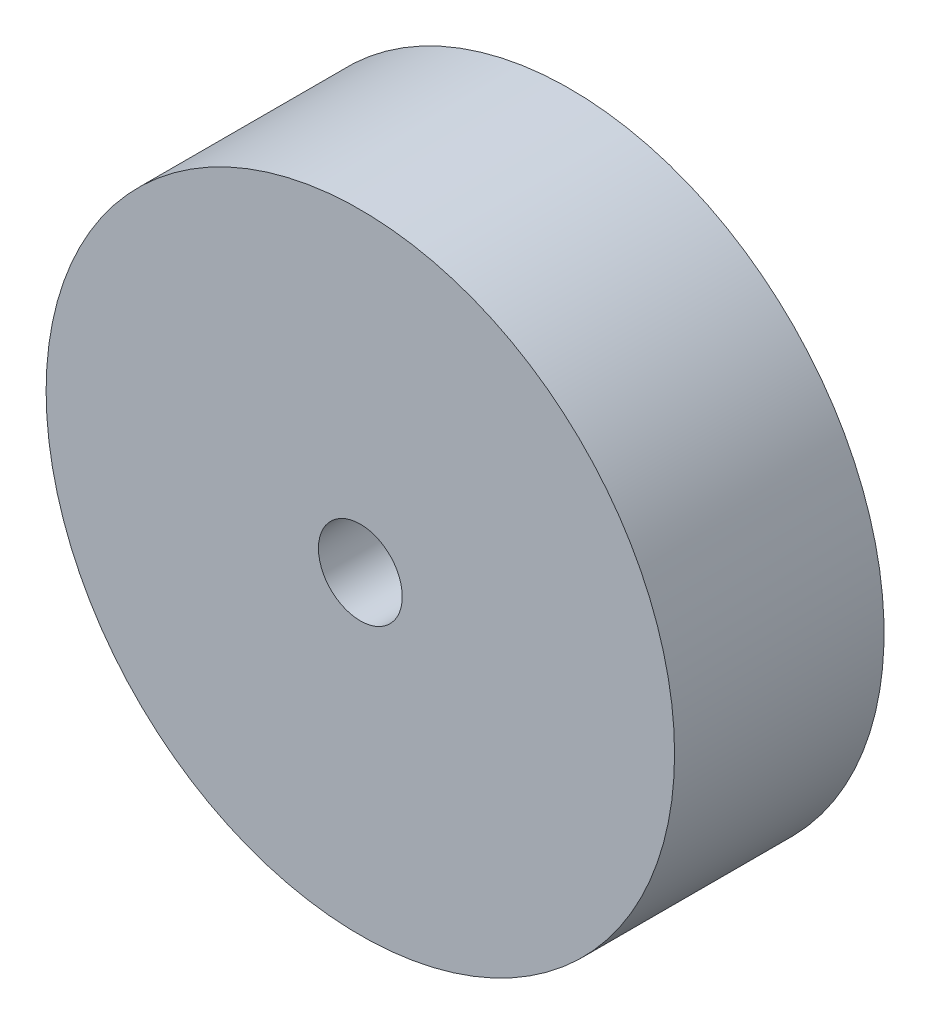
ISO-10303-21;
HEADER;
FILE_DESCRIPTION(('STEP AP214'),'2;1');
FILE_NAME('part.step','',(''),(''),'','','');
FILE_SCHEMA(('AUTOMOTIVE_DESIGN { 1 0 10303 214 1 1 1 1 }'));
ENDSEC;
DATA;
#1=APPLICATION_CONTEXT('core data for automotive mechanical design processes');
#2=APPLICATION_PROTOCOL_DEFINITION('international standard','automotive_design',2000,#1);
#3=PRODUCT_CONTEXT('',#1,'mechanical');
#4=PRODUCT('Part','Part','',(#3));
#5=PRODUCT_RELATED_PRODUCT_CATEGORY('part','',(#4));
#6=PRODUCT_DEFINITION_FORMATION('','',#4);
#7=PRODUCT_DEFINITION_CONTEXT('part definition',#1,'design');
#8=PRODUCT_DEFINITION('design','',#6,#7);
#9=PRODUCT_DEFINITION_SHAPE('','',#8);
#10=(LENGTH_UNIT() NAMED_UNIT(*) SI_UNIT(.MILLI.,.METRE.));
#11=(NAMED_UNIT(*) PLANE_ANGLE_UNIT() SI_UNIT($,.RADIAN.));
#12=(NAMED_UNIT(*) SI_UNIT($,.STERADIAN.) SOLID_ANGLE_UNIT());
#13=UNCERTAINTY_MEASURE_WITH_UNIT(LENGTH_MEASURE(1.E-05),#10,'distance_accuracy_value','');
#14=(GEOMETRIC_REPRESENTATION_CONTEXT(3) GLOBAL_UNCERTAINTY_ASSIGNED_CONTEXT((#13)) GLOBAL_UNIT_ASSIGNED_CONTEXT((#10,
#11,#12)) REPRESENTATION_CONTEXT('',''));
#15=CARTESIAN_POINT('',(0.,0.,0.));
#16=DIRECTION('',(0.,0.,1.));
#17=DIRECTION('',(1.,0.,0.));
#18=AXIS2_PLACEMENT_3D('',#15,#16,#17);
#19=CARTESIAN_POINT('',(0.,-10.,10.));
#20=DIRECTION('',(0.,0.,-1.));
#21=DIRECTION('',(-1.,0.,0.));
#22=AXIS2_PLACEMENT_3D('',#19,#20,#21);
#23=CYLINDRICAL_SURFACE('',#22,30.);
#24=CARTESIAN_POINT('',(0.,-10.,10.));
#25=DIRECTION('',(0.,0.,1.));
#26=DIRECTION('',(1.,0.,0.));
#27=AXIS2_PLACEMENT_3D('',#24,#25,#26);
#28=CIRCLE('',#27,30.);
#29=CARTESIAN_POINT('',(30.,-10.,10.));
#30=VERTEX_POINT('',#29);
#31=EDGE_CURVE('E119',#30,#30,#28,.T.);
#32=ORIENTED_EDGE('',*,*,#31,.F.);
#33=EDGE_LOOP('',(#32));
#34=FACE_BOUND('',#33,.T.);
#35=CARTESIAN_POINT('',(0.,-10.,-10.));
#36=DIRECTION('',(0.,0.,-1.));
#37=DIRECTION('',(-1.,0.,0.));
#38=AXIS2_PLACEMENT_3D('',#35,#36,#37);
#39=CIRCLE('',#38,30.);
#40=CARTESIAN_POINT('',(-30.,-10.,-10.));
#41=VERTEX_POINT('',#40);
#42=EDGE_CURVE('E85',#41,#41,#39,.T.);
#43=ORIENTED_EDGE('',*,*,#42,.F.);
#44=EDGE_LOOP('',(#43));
#45=FACE_BOUND('',#44,.T.);
#46=CARTESIAN_POINT('',(0.,-40.,-4.45));
#47=CARTESIAN_POINT('',(0.0813961460003312,-39.9999995308418,-4.44999640653951));
#48=CARTESIAN_POINT('',(0.162850100712571,-39.9996651849001,-4.44312318987351));
#49=CARTESIAN_POINT('',(0.323511229475847,-39.9983635552296,-4.4158019022667));
#50=CARTESIAN_POINT('',(0.402715637436591,-39.997395524718,-4.39533781438185));
#51=CARTESIAN_POINT('',(0.556527074857534,-39.9949360970782,-4.34142184323701));
#52=CARTESIAN_POINT('',(0.631136415445913,-39.9934449656171,-4.30797655182556));
#53=CARTESIAN_POINT('',(0.773661645076147,-39.9901073000316,-4.22905762393617));
#54=CARTESIAN_POINT('',(0.841579114472005,-39.988260850125,-4.18358683679256));
#55=CARTESIAN_POINT('',(0.968877717755085,-39.984418313588,-4.0818592699646));
#56=CARTESIAN_POINT('',(1.02825169584424,-39.982422103627,-4.02559353969628));
#57=CARTESIAN_POINT('',(1.13671696860404,-39.9785060970828,-3.90389102411298));
#58=CARTESIAN_POINT('',(1.1858078443272,-39.9765863036155,-3.83845386532284));
#59=CARTESIAN_POINT('',(1.27233271229274,-39.9730387578573,-3.7002290147037));
#60=CARTESIAN_POINT('',(1.30976118049563,-39.9714111441151,-3.62743786111723));
#61=CARTESIAN_POINT('',(1.37186331718921,-39.9686329838392,-3.47659567705896));
#62=CARTESIAN_POINT('',(1.3965370777827,-39.9674824338605,-3.39854468457348));
#63=CARTESIAN_POINT('',(1.43241066965505,-39.9657892492122,-3.23946365895841));
#64=CARTESIAN_POINT('',(1.44362111515415,-39.9652461356745,-3.15843602456853));
#65=CARTESIAN_POINT('',(1.45228259919691,-39.9648276310762,-2.99564732043953));
#66=CARTESIAN_POINT('',(1.44973374082222,-39.9649522350131,-2.91388625619968));
#67=CARTESIAN_POINT('',(1.43095781825595,-39.9658546688222,-2.75202371701596));
#68=CARTESIAN_POINT('',(1.41474222119876,-39.9666319510599,-2.67192090841777));
#69=CARTESIAN_POINT('',(1.36911089052534,-39.9687512700535,-2.5155756439929));
#70=CARTESIAN_POINT('',(1.33969510385768,-39.9700933090792,-2.43933320368237));
#71=CARTESIAN_POINT('',(1.26848529631535,-39.9731915107821,-2.2928359711007));
#72=CARTESIAN_POINT('',(1.22668604448058,-39.9749478484012,-2.2225837253595));
#73=CARTESIAN_POINT('',(1.13189964917487,-39.9786765085302,-2.0900889425306));
#74=CARTESIAN_POINT('',(1.07891243221142,-39.9806488324589,-2.02784645806245));
#75=CARTESIAN_POINT('',(0.963189493130265,-39.9845895954298,-1.91307128681583));
#76=CARTESIAN_POINT('',(0.90044383989432,-39.9865580284223,-1.86054861243243));
#77=CARTESIAN_POINT('',(0.767020061097306,-39.9902671971775,-1.76678113258274));
#78=CARTESIAN_POINT('',(0.69634193366628,-39.9920079328866,-1.72553632977504));
#79=CARTESIAN_POINT('',(0.549053669939396,-39.995065589583,-1.65549635646915));
#80=CARTESIAN_POINT('',(0.472443368908599,-39.9963824987957,-1.62670153184997));
#81=CARTESIAN_POINT('',(0.315468030618062,-39.9984439083815,-1.58238542283719));
#82=CARTESIAN_POINT('',(0.235103019637837,-39.9991884127603,-1.56686404555635));
#83=CARTESIAN_POINT('',(0.0729864578247865,-40.0000205893908,-1.54954775905255));
#84=CARTESIAN_POINT('',(-0.00876361043429312,-40.0001089243631,-1.54773900026662));
#85=CARTESIAN_POINT('',(-0.171406112902351,-39.9996205656173,-1.5578631572119));
#86=CARTESIAN_POINT('',(-0.252298549757869,-39.999043873952,-1.56979603052574));
#87=CARTESIAN_POINT('',(-0.410890762756939,-39.9972908468763,-1.60705325844742));
#88=CARTESIAN_POINT('',(-0.488592027041285,-39.9961147944773,-1.63237129294442));
#89=CARTESIAN_POINT('',(-0.638642069009016,-39.99329546512,-1.69567374996842));
#90=CARTESIAN_POINT('',(-0.71099081791748,-39.9916521856502,-1.73365824058377));
#91=CARTESIAN_POINT('',(-0.848345723324161,-39.988081638082,-1.82125084998025));
#92=CARTESIAN_POINT('',(-0.913345950957437,-39.9861541435242,-1.87086825651251));
#93=CARTESIAN_POINT('',(-1.0340990901978,-39.9822330101766,-1.98030466536306));
#94=CARTESIAN_POINT('',(-1.08985194615102,-39.9802393709887,-2.04012372907404));
#95=CARTESIAN_POINT('',(-1.19057431358054,-39.9764087682176,-2.16832496595439));
#96=CARTESIAN_POINT('',(-1.23553486699919,-39.9745719355994,-2.23671418153826));
#97=CARTESIAN_POINT('',(-1.31333514174595,-39.971264130688,-2.3800787918312));
#98=CARTESIAN_POINT('',(-1.34617491323864,-39.9697931568806,-2.45505415928042));
#99=CARTESIAN_POINT('',(-1.39878579339831,-39.9673838763665,-2.60942955527775));
#100=CARTESIAN_POINT('',(-1.41856262140465,-39.9664453365701,-2.68882763090177));
#101=CARTESIAN_POINT('',(-1.44450493257013,-39.9652061023154,-2.84982198015524));
#102=CARTESIAN_POINT('',(-1.45067048629445,-39.9649054045504,-2.93141824238637));
#103=CARTESIAN_POINT('',(-1.44921455310448,-39.9649758464478,-3.09440355257411));
#104=CARTESIAN_POINT('',(-1.44160716050053,-39.9653462993,-3.17579272710819));
#105=CARTESIAN_POINT('',(-1.41285040358935,-39.9667158379546,-3.33613697002824));
#106=CARTESIAN_POINT('',(-1.39170101334681,-39.967714924961,-3.41509203375216));
#107=CARTESIAN_POINT('',(-1.33646344572723,-39.9702289727417,-3.56832989210029));
#108=CARTESIAN_POINT('',(-1.30237515645711,-39.9717439379771,-3.64261264631281));
#109=CARTESIAN_POINT('',(-1.22222996276891,-39.9751189407715,-3.78440136622744));
#110=CARTESIAN_POINT('',(-1.17617343227222,-39.9769789675493,-3.85190754355749));
#111=CARTESIAN_POINT('',(-1.073349008138,-39.9808366095603,-3.97829703413931));
#112=CARTESIAN_POINT('',(-1.01657136229598,-39.9828343490017,-4.03717240929235));
#113=CARTESIAN_POINT('',(-0.893921457675356,-39.9867414138883,-4.14457395193336));
#114=CARTESIAN_POINT('',(-0.828046963500643,-39.9886507174473,-4.19309756817079));
#115=CARTESIAN_POINT('',(-0.689024274212108,-39.9921670067047,-4.2784393768834));
#116=CARTESIAN_POINT('',(-0.615869399786315,-39.9937737108046,-4.31524668794994));
#117=CARTESIAN_POINT('',(-0.464465388293116,-39.996499474131,-4.37601264032028));
#118=CARTESIAN_POINT('',(-0.386222397746535,-39.9976191096121,-4.39998647279687));
#119=CARTESIAN_POINT('',(-0.256243696705205,-39.9989481162876,-4.42810988613437));
#120=CARTESIAN_POINT('',(-0.205350070037261,-39.9993408413984,-4.43630821427063));
#121=CARTESIAN_POINT('',(-0.102978676194851,-39.9998669315744,-4.44725440586561));
#122=CARTESIAN_POINT('',(-0.0515009094841906,-40.0000002968454,-4.45000227365167));
#123=CARTESIAN_POINT('',(0.,-40.,-4.45));
#124=B_SPLINE_CURVE_WITH_KNOTS('',3,(#46,#47,#48,#49,#50,#51,#52,#53,#54,#55,#56,#57,#58,#59,
#60,#61,#62,#63,#64,#65,#66,#67,#68,#69,#70,#71,#72,#73,#74,#75,#76,#77,#78,#79,#80,#81,#82,#83,
#84,#85,#86,#87,#88,#89,#90,#91,#92,#93,#94,#95,#96,#97,#98,#99,#100,#101,#102,#103,#104,#105,
#106,#107,#108,#109,#110,#111,#112,#113,#114,#115,#116,#117,#118,#119,#120,#121,#122,#123),
.UNSPECIFIED.,.T.,.F.,(4,2,2,2,2,2,2,2,2,2,2,2,2,2,2,2,2,2,2,2,2,2,2,2,2,2,2,2,2,2,2,2,2,2,2,2,
2,2,4),(0.,0.244000441765333,0.488288951371507,0.732453573351615,0.976560394445798,
1.22087049735133,1.46519055184518,1.70962615616684,1.95405999537436,2.19830100084559,
2.44254017652002,2.68657462607092,2.93061005640273,3.17474871827232,3.41888898391141,
3.66327935580621,3.90766978531235,4.15206700391355,4.39646251221524,4.64061115136621,
4.88475903688662,5.12879174520659,5.37282576534188,5.61705529040786,5.86128628527784,
6.10571930635701,6.35015131578397,6.59447623465236,6.83879988685994,7.08287365592065,
7.32694789242691,7.57102423968747,7.81509296223529,8.05938477494153,8.30373672539321,
8.54831495773342,8.79260303551215,8.94698693769686,9.10137071730982),.UNSPECIFIED.);
#125=CARTESIAN_POINT('',(0.,-40.,-4.45));
#126=VERTEX_POINT('',#125);
#127=EDGE_CURVE('E100',#126,#126,#124,.T.);
#128=ORIENTED_EDGE('',*,*,#127,.F.);
#129=EDGE_LOOP('',(#128));
#130=FACE_BOUND('',#129,.T.);
#131=ADVANCED_FACE('F39',(#34,#45,#130),#23,.T.);
#132=CARTESIAN_POINT('',(0.,-10.,-10.));
#133=DIRECTION('',(0.,0.,-1.));
#134=DIRECTION('',(-1.,0.,0.));
#135=AXIS2_PLACEMENT_3D('',#132,#133,#134);
#136=PLANE('',#135);
#137=ORIENTED_EDGE('',*,*,#42,.T.);
#138=EDGE_LOOP('',(#137));
#139=FACE_BOUND('',#138,.T.);
#140=DIRECTION('',(1.,0.,0.));
#141=VECTOR('',#140,1.);
#142=CARTESIAN_POINT('',(0.,-20.1,-10.));
#143=LINE('',#142,#141);
#144=CARTESIAN_POINT('',(-25.5,-20.1,-10.));
#145=VERTEX_POINT('',#144);
#146=CARTESIAN_POINT('',(25.5,-20.1,-10.));
#147=VERTEX_POINT('',#146);
#148=EDGE_CURVE('E48',#145,#147,#143,.T.);
#149=ORIENTED_EDGE('',*,*,#148,.T.);
#150=DIRECTION('',(0.,1.,0.));
#151=VECTOR('',#150,1.);
#152=CARTESIAN_POINT('',(25.5,-10.,-10.));
#153=LINE('',#152,#151);
#154=CARTESIAN_POINT('',(25.5,0.100000000000001,-10.));
#155=VERTEX_POINT('',#154);
#156=EDGE_CURVE('E11',#147,#155,#153,.T.);
#157=ORIENTED_EDGE('',*,*,#156,.T.);
#158=DIRECTION('',(-1.,0.,0.));
#159=VECTOR('',#158,1.);
#160=CARTESIAN_POINT('',(0.,0.100000000000001,-10.));
#161=LINE('',#160,#159);
#162=CARTESIAN_POINT('',(-25.5,0.100000000000001,-10.));
#163=VERTEX_POINT('',#162);
#164=EDGE_CURVE('E122',#155,#163,#161,.T.);
#165=ORIENTED_EDGE('',*,*,#164,.T.);
#166=DIRECTION('',(0.,-1.,0.));
#167=VECTOR('',#166,1.);
#168=CARTESIAN_POINT('',(-25.5,-10.,-10.));
#169=LINE('',#168,#167);
#170=EDGE_CURVE('E125',#163,#145,#169,.T.);
#171=ORIENTED_EDGE('',*,*,#170,.T.);
#172=EDGE_LOOP('',(#149,#157,#165,#171));
#173=FACE_BOUND('',#172,.T.);
#174=ADVANCED_FACE('F129',(#139,#173),#136,.T.);
#175=CARTESIAN_POINT('',(0.,-10.,10.));
#176=DIRECTION('',(0.,0.,1.));
#177=DIRECTION('',(1.,0.,0.));
#178=AXIS2_PLACEMENT_3D('',#175,#176,#177);
#179=PLANE('',#178);
#180=CARTESIAN_POINT('',(0.,-10.,10.));
#181=DIRECTION('',(0.,0.,1.));
#182=DIRECTION('',(1.,0.,0.));
#183=AXIS2_PLACEMENT_3D('',#180,#181,#182);
#184=CIRCLE('',#183,4.);
#185=CARTESIAN_POINT('',(3.99999999999999,-10.,10.));
#186=VERTEX_POINT('',#185);
#187=EDGE_CURVE('E181',#186,#186,#184,.T.);
#188=ORIENTED_EDGE('',*,*,#187,.F.);
#189=EDGE_LOOP('',(#188));
#190=FACE_BOUND('',#189,.T.);
#191=ORIENTED_EDGE('',*,*,#31,.T.);
#192=EDGE_LOOP('',(#191));
#193=FACE_BOUND('',#192,.T.);
#194=ADVANCED_FACE('F149',(#190,#193),#179,.T.);
#195=CARTESIAN_POINT('',(25.5,0.100000000000001,-22.));
#196=DIRECTION('',(-1.,0.,0.));
#197=DIRECTION('',(0.,0.,1.));
#198=AXIS2_PLACEMENT_3D('',#195,#196,#197);
#199=PLANE('',#198);
#200=DIRECTION('',(0.,0.,1.));
#201=VECTOR('',#200,1.);
#202=CARTESIAN_POINT('',(25.5,-20.1,-22.));
#203=LINE('',#202,#201);
#204=CARTESIAN_POINT('',(25.5,-20.1,0.));
#205=VERTEX_POINT('',#204);
#206=EDGE_CURVE('E78',#147,#205,#203,.T.);
#207=ORIENTED_EDGE('',*,*,#206,.T.);
#208=DIRECTION('',(0.,-1.,0.));
#209=VECTOR('',#208,1.);
#210=CARTESIAN_POINT('',(25.5,0.100000000000001,0.));
#211=LINE('',#210,#209);
#212=CARTESIAN_POINT('',(25.5,0.100000000000001,0.));
#213=VERTEX_POINT('',#212);
#214=EDGE_CURVE('E82',#213,#205,#211,.T.);
#215=ORIENTED_EDGE('',*,*,#214,.F.);
#216=DIRECTION('',(0.,0.,1.));
#217=VECTOR('',#216,1.);
#218=CARTESIAN_POINT('',(25.5,0.100000000000001,-22.));
#219=LINE('',#218,#217);
#220=EDGE_CURVE('E113',#155,#213,#219,.T.);
#221=ORIENTED_EDGE('',*,*,#220,.F.);
#222=ORIENTED_EDGE('',*,*,#156,.F.);
#223=EDGE_LOOP('',(#207,#215,#221,#222));
#224=FACE_BOUND('',#223,.T.);
#225=ADVANCED_FACE('F80',(#224),#199,.T.);
#226=CARTESIAN_POINT('',(-25.5,-20.1,-22.));
#227=DIRECTION('',(0.,1.,0.));
#228=DIRECTION('',(0.,0.,1.));
#229=AXIS2_PLACEMENT_3D('',#226,#227,#228);
#230=PLANE('',#229);
#231=CARTESIAN_POINT('',(0.,-20.1,-3.));
#232=DIRECTION('',(0.,1.,0.));
#233=DIRECTION('',(0.,0.,1.));
#234=AXIS2_PLACEMENT_3D('',#231,#232,#233);
#235=CIRCLE('',#234,1.45);
#236=CARTESIAN_POINT('',(0.,-20.1,-1.55));
#237=VERTEX_POINT('',#236);
#238=EDGE_CURVE('E103',#237,#237,#235,.F.);
#239=ORIENTED_EDGE('',*,*,#238,.T.);
#240=EDGE_LOOP('',(#239));
#241=FACE_BOUND('',#240,.T.);
#242=DIRECTION('',(0.,0.,1.));
#243=VECTOR('',#242,1.);
#244=CARTESIAN_POINT('',(-25.5,-20.1,-22.));
#245=LINE('',#244,#243);
#246=CARTESIAN_POINT('',(-25.5,-20.1,0.));
#247=VERTEX_POINT('',#246);
#248=EDGE_CURVE('E86',#145,#247,#245,.T.);
#249=ORIENTED_EDGE('',*,*,#248,.T.);
#250=DIRECTION('',(-1.,0.,0.));
#251=VECTOR('',#250,1.);
#252=CARTESIAN_POINT('',(-25.5,-20.1,0.));
#253=LINE('',#252,#251);
#254=EDGE_CURVE('E89',#205,#247,#253,.T.);
#255=ORIENTED_EDGE('',*,*,#254,.F.);
#256=ORIENTED_EDGE('',*,*,#206,.F.);
#257=ORIENTED_EDGE('',*,*,#148,.F.);
#258=EDGE_LOOP('',(#249,#255,#256,#257));
#259=FACE_BOUND('',#258,.T.);
#260=ADVANCED_FACE('F90',(#241,#259),#230,.T.);
#261=CARTESIAN_POINT('',(-25.5,0.100000000000001,-22.));
#262=DIRECTION('',(1.,0.,0.));
#263=DIRECTION('',(0.,0.,-1.));
#264=AXIS2_PLACEMENT_3D('',#261,#262,#263);
#265=PLANE('',#264);
#266=DIRECTION('',(0.,0.,1.));
#267=VECTOR('',#266,1.);
#268=CARTESIAN_POINT('',(-25.5,0.100000000000001,-22.));
#269=LINE('',#268,#267);
#270=CARTESIAN_POINT('',(-25.5,0.100000000000001,0.));
#271=VERTEX_POINT('',#270);
#272=EDGE_CURVE('E55',#163,#271,#269,.T.);
#273=ORIENTED_EDGE('',*,*,#272,.T.);
#274=DIRECTION('',(0.,1.,0.));
#275=VECTOR('',#274,1.);
#276=CARTESIAN_POINT('',(-25.5,0.100000000000001,0.));
#277=LINE('',#276,#275);
#278=EDGE_CURVE('E95',#247,#271,#277,.T.);
#279=ORIENTED_EDGE('',*,*,#278,.F.);
#280=ORIENTED_EDGE('',*,*,#248,.F.);
#281=ORIENTED_EDGE('',*,*,#170,.F.);
#282=EDGE_LOOP('',(#273,#279,#280,#281));
#283=FACE_BOUND('',#282,.T.);
#284=ADVANCED_FACE('F131',(#283),#265,.T.);
#285=CARTESIAN_POINT('',(-25.5,0.100000000000001,-22.));
#286=DIRECTION('',(0.,-1.,0.));
#287=DIRECTION('',(0.,0.,-1.));
#288=AXIS2_PLACEMENT_3D('',#285,#286,#287);
#289=PLANE('',#288);
#290=CARTESIAN_POINT('',(0.,0.0999999999999994,-3.));
#291=DIRECTION('',(0.,-1.,0.));
#292=DIRECTION('',(0.,0.,-1.));
#293=AXIS2_PLACEMENT_3D('',#290,#291,#292);
#294=CIRCLE('',#293,1.45);
#295=CARTESIAN_POINT('',(0.,0.0999999999999994,-4.45));
#296=VERTEX_POINT('',#295);
#297=EDGE_CURVE('E43',#296,#296,#294,.F.);
#298=ORIENTED_EDGE('',*,*,#297,.T.);
#299=EDGE_LOOP('',(#298));
#300=FACE_BOUND('',#299,.T.);
#301=ORIENTED_EDGE('',*,*,#220,.T.);
#302=DIRECTION('',(1.,0.,0.));
#303=VECTOR('',#302,1.);
#304=CARTESIAN_POINT('',(-25.5,0.100000000000001,0.));
#305=LINE('',#304,#303);
#306=EDGE_CURVE('E99',#271,#213,#305,.T.);
#307=ORIENTED_EDGE('',*,*,#306,.F.);
#308=ORIENTED_EDGE('',*,*,#272,.F.);
#309=ORIENTED_EDGE('',*,*,#164,.F.);
#310=EDGE_LOOP('',(#301,#307,#308,#309));
#311=FACE_BOUND('',#310,.T.);
#312=ADVANCED_FACE('F132',(#300,#311),#289,.T.);
#313=CARTESIAN_POINT('',(0.,-10.,0.));
#314=DIRECTION('',(0.,0.,1.));
#315=DIRECTION('',(1.,0.,0.));
#316=AXIS2_PLACEMENT_3D('',#313,#314,#315);
#317=PLANE('',#316);
#318=CARTESIAN_POINT('',(0.,-10.,0.));
#319=DIRECTION('',(0.,0.,-1.));
#320=DIRECTION('',(-1.,0.,0.));
#321=AXIS2_PLACEMENT_3D('',#318,#319,#320);
#322=CIRCLE('',#321,4.);
#323=CARTESIAN_POINT('',(-4.00000000000001,-10.,0.));
#324=VERTEX_POINT('',#323);
#325=EDGE_CURVE('E184',#324,#324,#322,.T.);
#326=ORIENTED_EDGE('',*,*,#325,.F.);
#327=EDGE_LOOP('',(#326));
#328=FACE_BOUND('',#327,.T.);
#329=ORIENTED_EDGE('',*,*,#214,.T.);
#330=ORIENTED_EDGE('',*,*,#254,.T.);
#331=ORIENTED_EDGE('',*,*,#278,.T.);
#332=ORIENTED_EDGE('',*,*,#306,.T.);
#333=EDGE_LOOP('',(#329,#330,#331,#332));
#334=FACE_BOUND('',#333,.T.);
#335=ADVANCED_FACE('F98',(#328,#334),#317,.F.);
#336=CARTESIAN_POINT('',(0.,17.9,-3.));
#337=DIRECTION('',(0.,1.,0.));
#338=DIRECTION('',(0.,0.,1.));
#339=AXIS2_PLACEMENT_3D('',#336,#337,#338);
#340=PLANE('',#339);
#341=CARTESIAN_POINT('',(0.,17.9,-3.));
#342=DIRECTION('',(0.,1.,0.));
#343=DIRECTION('',(0.,0.,1.));
#344=AXIS2_PLACEMENT_3D('',#341,#342,#343);
#345=CIRCLE('',#344,1.45);
#346=CARTESIAN_POINT('',(0.,17.9,-1.55));
#347=VERTEX_POINT('',#346);
#348=EDGE_CURVE('E179',#347,#347,#345,.T.);
#349=ORIENTED_EDGE('',*,*,#348,.F.);
#350=EDGE_LOOP('',(#349));
#351=FACE_BOUND('',#350,.T.);
#352=ADVANCED_FACE('F140',(#351),#340,.F.);
#353=CARTESIAN_POINT('',(0.,17.9,-3.));
#354=DIRECTION('',(0.,-1.,0.));
#355=DIRECTION('',(0.,0.,-1.));
#356=AXIS2_PLACEMENT_3D('',#353,#354,#355);
#357=CYLINDRICAL_SURFACE('',#356,1.45);
#358=ORIENTED_EDGE('',*,*,#297,.F.);
#359=EDGE_LOOP('',(#358));
#360=FACE_BOUND('',#359,.T.);
#361=ORIENTED_EDGE('',*,*,#348,.T.);
#362=EDGE_LOOP('',(#361));
#363=FACE_BOUND('',#362,.T.);
#364=ADVANCED_FACE('F161',(#360,#363),#357,.F.);
#365=ORIENTED_EDGE('',*,*,#238,.F.);
#366=EDGE_LOOP('',(#365));
#367=FACE_BOUND('',#366,.T.);
#368=ORIENTED_EDGE('',*,*,#127,.T.);
#369=EDGE_LOOP('',(#368));
#370=FACE_BOUND('',#369,.T.);
#371=ADVANCED_FACE('F158',(#367,#370),#357,.F.);
#372=CARTESIAN_POINT('',(0.,-10.,57.));
#373=DIRECTION('',(0.,0.,-1.));
#374=DIRECTION('',(-1.,0.,0.));
#375=AXIS2_PLACEMENT_3D('',#372,#373,#374);
#376=CYLINDRICAL_SURFACE('',#375,4.);
#377=ORIENTED_EDGE('',*,*,#187,.T.);
#378=EDGE_LOOP('',(#377));
#379=FACE_BOUND('',#378,.T.);
#380=ORIENTED_EDGE('',*,*,#325,.T.);
#381=EDGE_LOOP('',(#380));
#382=FACE_BOUND('',#381,.T.);
#383=ADVANCED_FACE('F160',(#379,#382),#376,.F.);
#384=CLOSED_SHELL('',(#131,#174,#194,#225,#260,#284,#312,#335,#352,#364,#371,#383));
#385=MANIFOLD_SOLID_BREP('B2',#384);
#386=ADVANCED_BREP_SHAPE_REPRESENTATION('',(#18,#385),#14);
#387=SHAPE_DEFINITION_REPRESENTATION(#9,#386);
ENDSEC;
END-ISO-10303-21;
